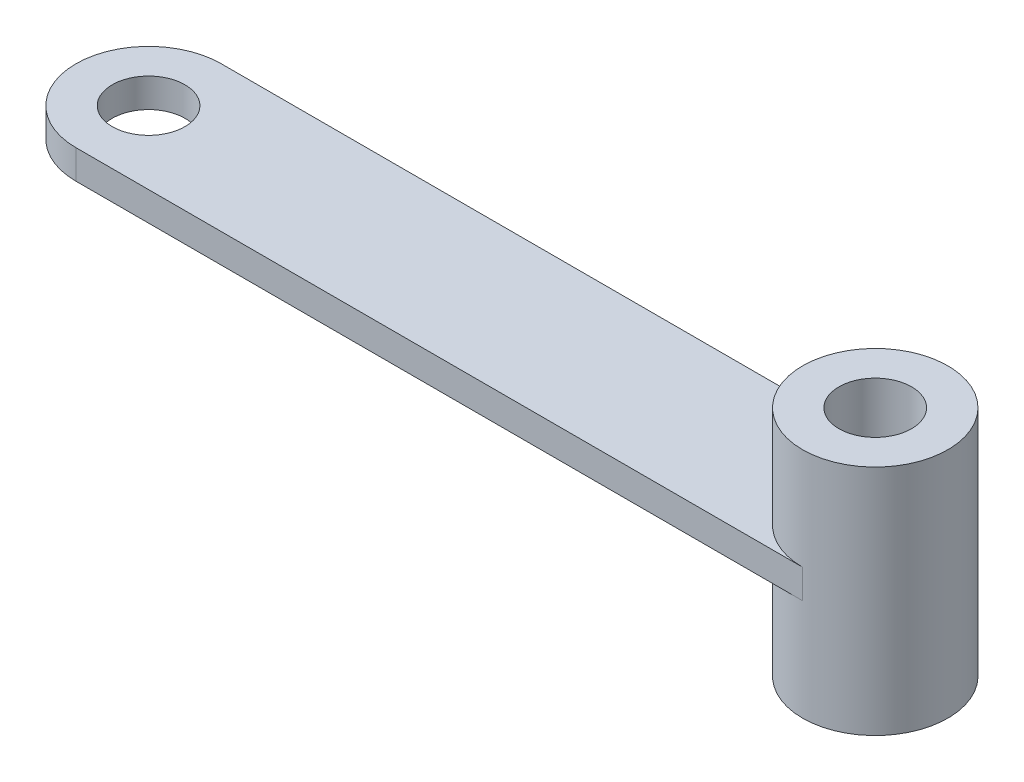
ISO-10303-21;
HEADER;
FILE_DESCRIPTION(('STEP AP214'),'2;1');
FILE_NAME('part.step','',(''),(''),'','','');
FILE_SCHEMA(('AUTOMOTIVE_DESIGN { 1 0 10303 214 1 1 1 1 }'));
ENDSEC;
DATA;
#1=APPLICATION_CONTEXT('core data for automotive mechanical design processes');
#2=APPLICATION_PROTOCOL_DEFINITION('international standard','automotive_design',2000,#1);
#3=PRODUCT_CONTEXT('',#1,'mechanical');
#4=PRODUCT('Part','Part','',(#3));
#5=PRODUCT_RELATED_PRODUCT_CATEGORY('part','',(#4));
#6=PRODUCT_DEFINITION_FORMATION('','',#4);
#7=PRODUCT_DEFINITION_CONTEXT('part definition',#1,'design');
#8=PRODUCT_DEFINITION('design','',#6,#7);
#9=PRODUCT_DEFINITION_SHAPE('','',#8);
#10=(LENGTH_UNIT() NAMED_UNIT(*) SI_UNIT(.MILLI.,.METRE.));
#11=(NAMED_UNIT(*) PLANE_ANGLE_UNIT() SI_UNIT($,.RADIAN.));
#12=(NAMED_UNIT(*) SI_UNIT($,.STERADIAN.) SOLID_ANGLE_UNIT());
#13=UNCERTAINTY_MEASURE_WITH_UNIT(LENGTH_MEASURE(1.E-05),#10,'distance_accuracy_value','');
#14=(GEOMETRIC_REPRESENTATION_CONTEXT(3) GLOBAL_UNCERTAINTY_ASSIGNED_CONTEXT((#13)) GLOBAL_UNIT_ASSIGNED_CONTEXT((#10,
#11,#12)) REPRESENTATION_CONTEXT('',''));
#15=CARTESIAN_POINT('',(0.,0.,0.));
#16=DIRECTION('',(0.,0.,1.));
#17=DIRECTION('',(1.,0.,0.));
#18=AXIS2_PLACEMENT_3D('',#15,#16,#17);
#19=CARTESIAN_POINT('',(0.,2.,0.));
#20=DIRECTION('',(0.,1.,0.));
#21=DIRECTION('',(0.,0.,1.));
#22=AXIS2_PLACEMENT_3D('',#19,#20,#21);
#23=PLANE('',#22);
#24=CARTESIAN_POINT('',(50.,2.,0.));
#25=DIRECTION('',(0.,1.,0.));
#26=DIRECTION('',(0.,0.,1.));
#27=AXIS2_PLACEMENT_3D('',#24,#25,#26);
#28=CIRCLE('',#27,5.);
#29=CARTESIAN_POINT('',(50.,2.,-5.));
#30=VERTEX_POINT('',#29);
#31=CARTESIAN_POINT('',(50.,2.,5.));
#32=VERTEX_POINT('',#31);
#33=EDGE_CURVE('E86',#30,#32,#28,.T.);
#34=ORIENTED_EDGE('',*,*,#33,.F.);
#35=DIRECTION('',(-1.,0.,0.));
#36=VECTOR('',#35,1.);
#37=CARTESIAN_POINT('',(0.,2.,-5.));
#38=LINE('',#37,#36);
#39=CARTESIAN_POINT('',(0.,2.,-5.));
#40=VERTEX_POINT('',#39);
#41=EDGE_CURVE('E50',#30,#40,#38,.T.);
#42=ORIENTED_EDGE('',*,*,#41,.T.);
#43=CARTESIAN_POINT('',(0.,2.,0.));
#44=DIRECTION('',(0.,1.,0.));
#45=DIRECTION('',(0.,0.,1.));
#46=AXIS2_PLACEMENT_3D('',#43,#44,#45);
#47=CIRCLE('',#46,5.);
#48=CARTESIAN_POINT('',(0.,2.,5.));
#49=VERTEX_POINT('',#48);
#50=EDGE_CURVE('E97',#40,#49,#47,.T.);
#51=ORIENTED_EDGE('',*,*,#50,.T.);
#52=DIRECTION('',(1.,0.,0.));
#53=VECTOR('',#52,1.);
#54=CARTESIAN_POINT('',(0.,2.,5.));
#55=LINE('',#54,#53);
#56=EDGE_CURVE('E75',#49,#32,#55,.T.);
#57=ORIENTED_EDGE('',*,*,#56,.T.);
#58=EDGE_LOOP('',(#34,#42,#51,#57));
#59=FACE_BOUND('',#58,.T.);
#60=CARTESIAN_POINT('',(0.,2.,0.));
#61=DIRECTION('',(0.,1.,0.));
#62=DIRECTION('',(0.,0.,1.));
#63=AXIS2_PLACEMENT_3D('',#60,#61,#62);
#64=CIRCLE('',#63,2.5);
#65=CARTESIAN_POINT('',(0.,2.,2.5));
#66=VERTEX_POINT('',#65);
#67=EDGE_CURVE('E108',#66,#66,#64,.T.);
#68=ORIENTED_EDGE('',*,*,#67,.F.);
#69=EDGE_LOOP('',(#68));
#70=FACE_BOUND('',#69,.T.);
#71=ADVANCED_FACE('F33',(#59,#70),#23,.T.);
#72=CARTESIAN_POINT('',(0.,0.,0.));
#73=DIRECTION('',(0.,1.,0.));
#74=DIRECTION('',(0.,0.,1.));
#75=AXIS2_PLACEMENT_3D('',#72,#73,#74);
#76=PLANE('',#75);
#77=DIRECTION('',(-1.,0.,0.));
#78=VECTOR('',#77,1.);
#79=CARTESIAN_POINT('',(0.,0.,-5.));
#80=LINE('',#79,#78);
#81=CARTESIAN_POINT('',(50.,0.,-5.));
#82=VERTEX_POINT('',#81);
#83=CARTESIAN_POINT('',(0.,0.,-5.));
#84=VERTEX_POINT('',#83);
#85=EDGE_CURVE('E69',#82,#84,#80,.T.);
#86=ORIENTED_EDGE('',*,*,#85,.F.);
#87=CARTESIAN_POINT('',(50.,0.,0.));
#88=DIRECTION('',(0.,1.,0.));
#89=DIRECTION('',(0.,0.,1.));
#90=AXIS2_PLACEMENT_3D('',#87,#88,#89);
#91=CIRCLE('',#90,5.);
#92=CARTESIAN_POINT('',(50.,0.,5.));
#93=VERTEX_POINT('',#92);
#94=EDGE_CURVE('E64',#82,#93,#91,.T.);
#95=ORIENTED_EDGE('',*,*,#94,.T.);
#96=DIRECTION('',(1.,0.,0.));
#97=VECTOR('',#96,1.);
#98=CARTESIAN_POINT('',(0.,0.,5.));
#99=LINE('',#98,#97);
#100=CARTESIAN_POINT('',(0.,0.,5.));
#101=VERTEX_POINT('',#100);
#102=EDGE_CURVE('E98',#101,#93,#99,.T.);
#103=ORIENTED_EDGE('',*,*,#102,.F.);
#104=CARTESIAN_POINT('',(0.,0.,0.));
#105=DIRECTION('',(0.,1.,0.));
#106=DIRECTION('',(0.,0.,1.));
#107=AXIS2_PLACEMENT_3D('',#104,#105,#106);
#108=CIRCLE('',#107,5.);
#109=EDGE_CURVE('E96',#84,#101,#108,.T.);
#110=ORIENTED_EDGE('',*,*,#109,.F.);
#111=EDGE_LOOP('',(#86,#95,#103,#110));
#112=FACE_BOUND('',#111,.T.);
#113=CARTESIAN_POINT('',(0.,0.,0.));
#114=DIRECTION('',(0.,1.,0.));
#115=DIRECTION('',(0.,0.,1.));
#116=AXIS2_PLACEMENT_3D('',#113,#114,#115);
#117=CIRCLE('',#116,2.5);
#118=CARTESIAN_POINT('',(0.,0.,2.5));
#119=VERTEX_POINT('',#118);
#120=EDGE_CURVE('E111',#119,#119,#117,.T.);
#121=ORIENTED_EDGE('',*,*,#120,.T.);
#122=EDGE_LOOP('',(#121));
#123=FACE_BOUND('',#122,.T.);
#124=ADVANCED_FACE('F93',(#112,#123),#76,.F.);
#125=CARTESIAN_POINT('',(0.,2.,0.));
#126=DIRECTION('',(0.,-1.,0.));
#127=DIRECTION('',(0.,0.,-1.));
#128=AXIS2_PLACEMENT_3D('',#125,#126,#127);
#129=CYLINDRICAL_SURFACE('',#128,5.);
#130=ORIENTED_EDGE('',*,*,#109,.T.);
#131=DIRECTION('',(0.,-1.,0.));
#132=VECTOR('',#131,1.);
#133=CARTESIAN_POINT('',(0.,2.,5.));
#134=LINE('',#133,#132);
#135=EDGE_CURVE('E11',#49,#101,#134,.T.);
#136=ORIENTED_EDGE('',*,*,#135,.F.);
#137=ORIENTED_EDGE('',*,*,#50,.F.);
#138=DIRECTION('',(0.,-1.,0.));
#139=VECTOR('',#138,1.);
#140=CARTESIAN_POINT('',(0.,2.,-5.));
#141=LINE('',#140,#139);
#142=EDGE_CURVE('E90',#40,#84,#141,.T.);
#143=ORIENTED_EDGE('',*,*,#142,.T.);
#144=EDGE_LOOP('',(#130,#136,#137,#143));
#145=FACE_BOUND('',#144,.T.);
#146=ADVANCED_FACE('F35',(#145),#129,.T.);
#147=CARTESIAN_POINT('',(0.,2.,5.));
#148=DIRECTION('',(0.,0.,-1.));
#149=DIRECTION('',(-1.,0.,0.));
#150=AXIS2_PLACEMENT_3D('',#147,#148,#149);
#151=PLANE('',#150);
#152=ORIENTED_EDGE('',*,*,#102,.T.);
#153=DIRECTION('',(0.,-1.,0.));
#154=VECTOR('',#153,1.);
#155=CARTESIAN_POINT('',(50.,2.,5.));
#156=LINE('',#155,#154);
#157=EDGE_CURVE('E42',#32,#93,#156,.T.);
#158=ORIENTED_EDGE('',*,*,#157,.F.);
#159=ORIENTED_EDGE('',*,*,#56,.F.);
#160=ORIENTED_EDGE('',*,*,#135,.T.);
#161=EDGE_LOOP('',(#152,#158,#159,#160));
#162=FACE_BOUND('',#161,.T.);
#163=ADVANCED_FACE('F157',(#162),#151,.F.);
#164=CARTESIAN_POINT('',(50.,2.,0.));
#165=DIRECTION('',(0.,-1.,0.));
#166=DIRECTION('',(0.,0.,-1.));
#167=AXIS2_PLACEMENT_3D('',#164,#165,#166);
#168=CYLINDRICAL_SURFACE('',#167,5.);
#169=ORIENTED_EDGE('',*,*,#157,.T.);
#170=ORIENTED_EDGE('',*,*,#94,.F.);
#171=DIRECTION('',(0.,-1.,0.));
#172=VECTOR('',#171,1.);
#173=CARTESIAN_POINT('',(50.,2.,-5.));
#174=LINE('',#173,#172);
#175=EDGE_CURVE('E85',#30,#82,#174,.T.);
#176=ORIENTED_EDGE('',*,*,#175,.F.);
#177=ORIENTED_EDGE('',*,*,#33,.T.);
#178=EDGE_LOOP('',(#169,#170,#176,#177));
#179=FACE_BOUND('',#178,.T.);
#180=CARTESIAN_POINT('',(50.,-7.,0.));
#181=DIRECTION('',(0.,1.,0.));
#182=DIRECTION('',(0.,0.,1.));
#183=AXIS2_PLACEMENT_3D('',#180,#181,#182);
#184=CIRCLE('',#183,5.);
#185=CARTESIAN_POINT('',(50.,-7.,5.));
#186=VERTEX_POINT('',#185);
#187=EDGE_CURVE('E87',#186,#186,#184,.T.);
#188=ORIENTED_EDGE('',*,*,#187,.T.);
#189=EDGE_LOOP('',(#188));
#190=FACE_BOUND('',#189,.T.);
#191=CARTESIAN_POINT('',(50.,9.,0.));
#192=DIRECTION('',(0.,1.,0.));
#193=DIRECTION('',(0.,0.,1.));
#194=AXIS2_PLACEMENT_3D('',#191,#192,#193);
#195=CIRCLE('',#194,5.);
#196=CARTESIAN_POINT('',(50.,9.,5.));
#197=VERTEX_POINT('',#196);
#198=EDGE_CURVE('E124',#197,#197,#195,.T.);
#199=ORIENTED_EDGE('',*,*,#198,.F.);
#200=EDGE_LOOP('',(#199));
#201=FACE_BOUND('',#200,.T.);
#202=ADVANCED_FACE('F82',(#179,#190,#201),#168,.T.);
#203=CARTESIAN_POINT('',(0.,2.,-5.));
#204=DIRECTION('',(0.,0.,1.));
#205=DIRECTION('',(1.,0.,0.));
#206=AXIS2_PLACEMENT_3D('',#203,#204,#205);
#207=PLANE('',#206);
#208=ORIENTED_EDGE('',*,*,#85,.T.);
#209=ORIENTED_EDGE('',*,*,#142,.F.);
#210=ORIENTED_EDGE('',*,*,#41,.F.);
#211=ORIENTED_EDGE('',*,*,#175,.T.);
#212=EDGE_LOOP('',(#208,#209,#210,#211));
#213=FACE_BOUND('',#212,.T.);
#214=ADVANCED_FACE('F89',(#213),#207,.F.);
#215=CARTESIAN_POINT('',(0.,2.,0.));
#216=DIRECTION('',(0.,-1.,0.));
#217=DIRECTION('',(0.,0.,-1.));
#218=AXIS2_PLACEMENT_3D('',#215,#216,#217);
#219=CYLINDRICAL_SURFACE('',#218,2.5);
#220=ORIENTED_EDGE('',*,*,#67,.T.);
#221=EDGE_LOOP('',(#220));
#222=FACE_BOUND('',#221,.T.);
#223=ORIENTED_EDGE('',*,*,#120,.F.);
#224=EDGE_LOOP('',(#223));
#225=FACE_BOUND('',#224,.T.);
#226=ADVANCED_FACE('F152',(#222,#225),#219,.F.);
#227=CARTESIAN_POINT('',(50.,-7.,0.));
#228=DIRECTION('',(0.,1.,0.));
#229=DIRECTION('',(0.,0.,1.));
#230=AXIS2_PLACEMENT_3D('',#227,#228,#229);
#231=PLANE('',#230);
#232=CARTESIAN_POINT('',(50.,-7.,0.));
#233=DIRECTION('',(0.,1.,0.));
#234=DIRECTION('',(0.,0.,1.));
#235=AXIS2_PLACEMENT_3D('',#232,#233,#234);
#236=CIRCLE('',#235,2.5);
#237=CARTESIAN_POINT('',(50.,-7.,2.5));
#238=VERTEX_POINT('',#237);
#239=EDGE_CURVE('E121',#238,#238,#236,.T.);
#240=ORIENTED_EDGE('',*,*,#239,.T.);
#241=EDGE_LOOP('',(#240));
#242=FACE_BOUND('',#241,.T.);
#243=ORIENTED_EDGE('',*,*,#187,.F.);
#244=EDGE_LOOP('',(#243));
#245=FACE_BOUND('',#244,.T.);
#246=ADVANCED_FACE('F140',(#242,#245),#231,.F.);
#247=CARTESIAN_POINT('',(50.,2.,0.));
#248=DIRECTION('',(0.,-1.,0.));
#249=DIRECTION('',(0.,0.,-1.));
#250=AXIS2_PLACEMENT_3D('',#247,#248,#249);
#251=CYLINDRICAL_SURFACE('',#250,2.5);
#252=ORIENTED_EDGE('',*,*,#239,.F.);
#253=EDGE_LOOP('',(#252));
#254=FACE_BOUND('',#253,.T.);
#255=CARTESIAN_POINT('',(50.,9.,0.));
#256=DIRECTION('',(0.,1.,0.));
#257=DIRECTION('',(0.,0.,1.));
#258=AXIS2_PLACEMENT_3D('',#255,#256,#257);
#259=CIRCLE('',#258,2.5);
#260=CARTESIAN_POINT('',(50.,9.,2.5));
#261=VERTEX_POINT('',#260);
#262=EDGE_CURVE('E127',#261,#261,#259,.T.);
#263=ORIENTED_EDGE('',*,*,#262,.T.);
#264=EDGE_LOOP('',(#263));
#265=FACE_BOUND('',#264,.T.);
#266=ADVANCED_FACE('F131',(#254,#265),#251,.F.);
#267=CARTESIAN_POINT('',(50.,9.,0.));
#268=DIRECTION('',(0.,1.,0.));
#269=DIRECTION('',(0.,0.,1.));
#270=AXIS2_PLACEMENT_3D('',#267,#268,#269);
#271=PLANE('',#270);
#272=ORIENTED_EDGE('',*,*,#198,.T.);
#273=EDGE_LOOP('',(#272));
#274=FACE_BOUND('',#273,.T.);
#275=ORIENTED_EDGE('',*,*,#262,.F.);
#276=EDGE_LOOP('',(#275));
#277=FACE_BOUND('',#276,.T.);
#278=ADVANCED_FACE('F133',(#274,#277),#271,.T.);
#279=CLOSED_SHELL('',(#71,#124,#146,#163,#202,#214,#226,#246,#266,#278));
#280=MANIFOLD_SOLID_BREP('B2',#279);
#281=ADVANCED_BREP_SHAPE_REPRESENTATION('',(#18,#280),#14);
#282=SHAPE_DEFINITION_REPRESENTATION(#9,#281);
ENDSEC;
END-ISO-10303-21;
